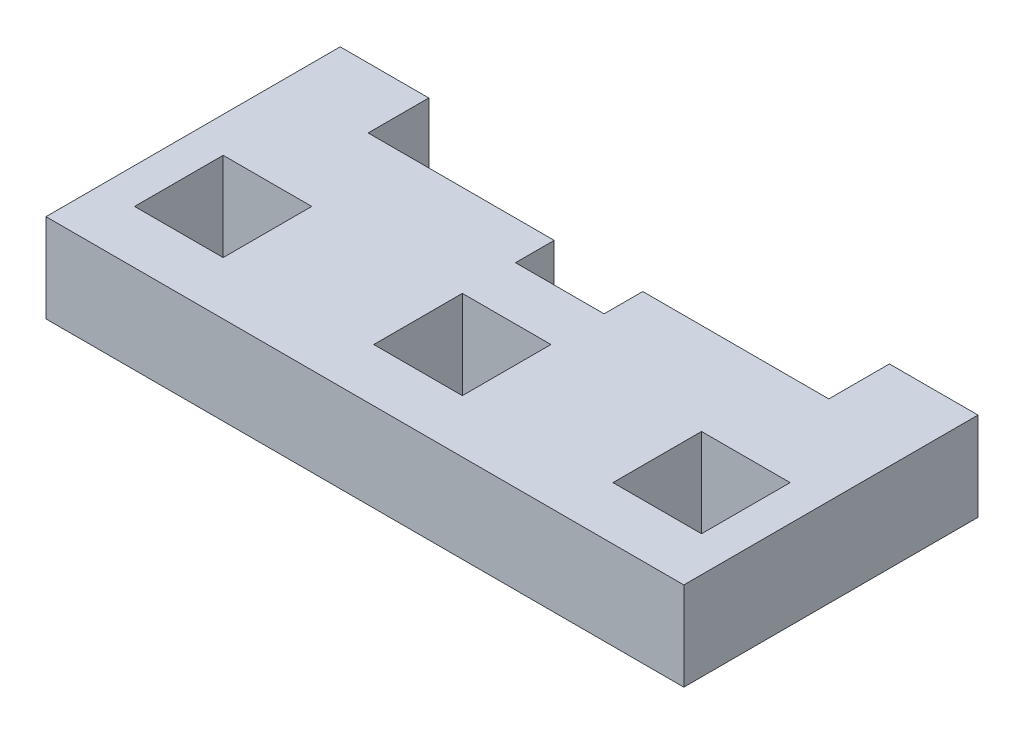
ISO-10303-21;
HEADER;
FILE_DESCRIPTION(('STEP AP214'),'2;1');
FILE_NAME('part.step','',(''),(''),'','','');
FILE_SCHEMA(('AUTOMOTIVE_DESIGN { 1 0 10303 214 1 1 1 1 }'));
ENDSEC;
DATA;
#1=APPLICATION_CONTEXT('core data for automotive mechanical design processes');
#2=APPLICATION_PROTOCOL_DEFINITION('international standard','automotive_design',2000,#1);
#3=PRODUCT_CONTEXT('',#1,'mechanical');
#4=PRODUCT('Part','Part','',(#3));
#5=PRODUCT_RELATED_PRODUCT_CATEGORY('part','',(#4));
#6=PRODUCT_DEFINITION_FORMATION('','',#4);
#7=PRODUCT_DEFINITION_CONTEXT('part definition',#1,'design');
#8=PRODUCT_DEFINITION('design','',#6,#7);
#9=PRODUCT_DEFINITION_SHAPE('','',#8);
#10=(LENGTH_UNIT() NAMED_UNIT(*) SI_UNIT(.MILLI.,.METRE.));
#11=(NAMED_UNIT(*) PLANE_ANGLE_UNIT() SI_UNIT($,.RADIAN.));
#12=(NAMED_UNIT(*) SI_UNIT($,.STERADIAN.) SOLID_ANGLE_UNIT());
#13=UNCERTAINTY_MEASURE_WITH_UNIT(LENGTH_MEASURE(1.E-05),#10,'distance_accuracy_value','');
#14=(GEOMETRIC_REPRESENTATION_CONTEXT(3) GLOBAL_UNCERTAINTY_ASSIGNED_CONTEXT((#13)) GLOBAL_UNIT_ASSIGNED_CONTEXT((#10,
#11,#12)) REPRESENTATION_CONTEXT('',''));
#15=CARTESIAN_POINT('',(0.,0.,0.));
#16=DIRECTION('',(0.,0.,1.));
#17=DIRECTION('',(1.,0.,0.));
#18=AXIS2_PLACEMENT_3D('',#15,#16,#17);
#19=CARTESIAN_POINT('',(0.,6.35,0.));
#20=DIRECTION('',(0.,-1.,0.));
#21=DIRECTION('',(0.,0.,-1.));
#22=AXIS2_PLACEMENT_3D('',#19,#20,#21);
#23=PLANE('',#22);
#24=DIRECTION('',(0.,0.,-1.));
#25=VECTOR('',#24,1.);
#26=CARTESIAN_POINT('',(20.32,6.35,3.175));
#27=LINE('',#26,#25);
#28=CARTESIAN_POINT('',(20.32,6.35,3.175));
#29=VERTEX_POINT('',#28);
#30=CARTESIAN_POINT('',(20.32,6.35,-3.175));
#31=VERTEX_POINT('',#30);
#32=EDGE_CURVE('E230',#29,#31,#27,.T.);
#33=ORIENTED_EDGE('',*,*,#32,.F.);
#34=DIRECTION('',(1.,0.,0.));
#35=VECTOR('',#34,1.);
#36=CARTESIAN_POINT('',(20.32,6.35,3.175));
#37=LINE('',#36,#35);
#38=CARTESIAN_POINT('',(13.97,6.35,3.175));
#39=VERTEX_POINT('',#38);
#40=EDGE_CURVE('E238',#39,#29,#37,.T.);
#41=ORIENTED_EDGE('',*,*,#40,.F.);
#42=DIRECTION('',(0.,0.,1.));
#43=VECTOR('',#42,1.);
#44=CARTESIAN_POINT('',(13.97,6.35,3.175));
#45=LINE('',#44,#43);
#46=CARTESIAN_POINT('',(13.97,6.35,-3.175));
#47=VERTEX_POINT('',#46);
#48=EDGE_CURVE('E235',#47,#39,#45,.T.);
#49=ORIENTED_EDGE('',*,*,#48,.F.);
#50=DIRECTION('',(-1.,0.,0.));
#51=VECTOR('',#50,1.);
#52=CARTESIAN_POINT('',(20.32,6.35,-3.175));
#53=LINE('',#52,#51);
#54=EDGE_CURVE('E232',#31,#47,#53,.T.);
#55=ORIENTED_EDGE('',*,*,#54,.F.);
#56=EDGE_LOOP('',(#33,#41,#49,#55));
#57=FACE_BOUND('',#56,.T.);
#58=DIRECTION('',(0.,0.,1.));
#59=VECTOR('',#58,1.);
#60=CARTESIAN_POINT('',(-22.86,6.35,6.985));
#61=LINE('',#60,#59);
#62=CARTESIAN_POINT('',(-22.86,6.35,-14.102499989));
#63=VERTEX_POINT('',#62);
#64=CARTESIAN_POINT('',(-22.86,6.35,6.985));
#65=VERTEX_POINT('',#64);
#66=EDGE_CURVE('E292',#63,#65,#61,.T.);
#67=ORIENTED_EDGE('',*,*,#66,.T.);
#68=DIRECTION('',(1.,0.,0.));
#69=VECTOR('',#68,1.);
#70=CARTESIAN_POINT('',(-22.86,6.35,6.985));
#71=LINE('',#70,#69);
#72=CARTESIAN_POINT('',(22.86,6.35,6.985));
#73=VERTEX_POINT('',#72);
#74=EDGE_CURVE('E295',#65,#73,#71,.T.);
#75=ORIENTED_EDGE('',*,*,#74,.T.);
#76=DIRECTION('',(0.,0.,-1.));
#77=VECTOR('',#76,1.);
#78=CARTESIAN_POINT('',(22.86,6.35,6.985));
#79=LINE('',#78,#77);
#80=CARTESIAN_POINT('',(22.86,6.35,-14.102499989));
#81=VERTEX_POINT('',#80);
#82=EDGE_CURVE('E298',#73,#81,#79,.T.);
#83=ORIENTED_EDGE('',*,*,#82,.T.);
#84=DIRECTION('',(-1.,0.,0.));
#85=VECTOR('',#84,1.);
#86=CARTESIAN_POINT('',(22.86,6.35,-14.102499989));
#87=LINE('',#86,#85);
#88=CARTESIAN_POINT('',(16.51,6.35,-14.102499989));
#89=VERTEX_POINT('',#88);
#90=EDGE_CURVE('E300',#81,#89,#87,.T.);
#91=ORIENTED_EDGE('',*,*,#90,.T.);
#92=DIRECTION('',(0.,0.,1.));
#93=VECTOR('',#92,1.);
#94=CARTESIAN_POINT('',(16.51,6.35,-14.102499989));
#95=LINE('',#94,#93);
#96=CARTESIAN_POINT('',(16.51,6.35,-9.75750004299999));
#97=VERTEX_POINT('',#96);
#98=EDGE_CURVE('E302',#89,#97,#95,.T.);
#99=ORIENTED_EDGE('',*,*,#98,.T.);
#100=DIRECTION('',(-1.,0.,0.));
#101=VECTOR('',#100,1.);
#102=CARTESIAN_POINT('',(3.175,6.35,-9.75750004299999));
#103=LINE('',#102,#101);
#104=CARTESIAN_POINT('',(3.175,6.35,-9.75750004299999));
#105=VERTEX_POINT('',#104);
#106=EDGE_CURVE('E304',#97,#105,#103,.T.);
#107=ORIENTED_EDGE('',*,*,#106,.T.);
#108=DIRECTION('',(0.,0.,1.));
#109=VECTOR('',#108,1.);
#110=CARTESIAN_POINT('',(3.175,6.35,-6.985));
#111=LINE('',#110,#109);
#112=CARTESIAN_POINT('',(3.175,6.35,-6.985));
#113=VERTEX_POINT('',#112);
#114=EDGE_CURVE('E306',#105,#113,#111,.T.);
#115=ORIENTED_EDGE('',*,*,#114,.T.);
#116=DIRECTION('',(-1.,0.,0.));
#117=VECTOR('',#116,1.);
#118=CARTESIAN_POINT('',(-3.175,6.35,-6.98500000000001));
#119=LINE('',#118,#117);
#120=CARTESIAN_POINT('',(-3.175,6.35,-6.98500000000001));
#121=VERTEX_POINT('',#120);
#122=EDGE_CURVE('E308',#113,#121,#119,.T.);
#123=ORIENTED_EDGE('',*,*,#122,.T.);
#124=DIRECTION('',(0.,0.,-1.));
#125=VECTOR('',#124,1.);
#126=CARTESIAN_POINT('',(-3.175,6.35,-9.75750004299999));
#127=LINE('',#126,#125);
#128=CARTESIAN_POINT('',(-3.175,6.35,-9.75750004299999));
#129=VERTEX_POINT('',#128);
#130=EDGE_CURVE('E310',#121,#129,#127,.T.);
#131=ORIENTED_EDGE('',*,*,#130,.T.);
#132=DIRECTION('',(-1.,0.,0.));
#133=VECTOR('',#132,1.);
#134=CARTESIAN_POINT('',(-16.51,6.35,-9.75750004299999));
#135=LINE('',#134,#133);
#136=CARTESIAN_POINT('',(-16.51,6.35,-9.75750004299999));
#137=VERTEX_POINT('',#136);
#138=EDGE_CURVE('E312',#129,#137,#135,.T.);
#139=ORIENTED_EDGE('',*,*,#138,.T.);
#140=DIRECTION('',(0.,0.,-1.));
#141=VECTOR('',#140,1.);
#142=CARTESIAN_POINT('',(-16.51,6.35,-14.102499989));
#143=LINE('',#142,#141);
#144=CARTESIAN_POINT('',(-16.51,6.35,-14.102499989));
#145=VERTEX_POINT('',#144);
#146=EDGE_CURVE('E314',#137,#145,#143,.T.);
#147=ORIENTED_EDGE('',*,*,#146,.T.);
#148=DIRECTION('',(-1.,0.,0.));
#149=VECTOR('',#148,1.);
#150=CARTESIAN_POINT('',(-22.86,6.35,-14.102499989));
#151=LINE('',#150,#149);
#152=EDGE_CURVE('E316',#145,#63,#151,.T.);
#153=ORIENTED_EDGE('',*,*,#152,.T.);
#154=EDGE_LOOP('',(#67,#75,#83,#91,#99,#107,#115,#123,#131,#139,#147,#153));
#155=FACE_BOUND('',#154,.T.);
#156=DIRECTION('',(0.,0.,-1.));
#157=VECTOR('',#156,1.);
#158=CARTESIAN_POINT('',(3.175,6.35,-3.17500000000001));
#159=LINE('',#158,#157);
#160=CARTESIAN_POINT('',(3.175,6.35,3.17500000000001));
#161=VERTEX_POINT('',#160);
#162=CARTESIAN_POINT('',(3.175,6.35,-3.17500000000001));
#163=VERTEX_POINT('',#162);
#164=EDGE_CURVE('E261',#161,#163,#159,.T.);
#165=ORIENTED_EDGE('',*,*,#164,.F.);
#166=DIRECTION('',(1.,0.,0.));
#167=VECTOR('',#166,1.);
#168=CARTESIAN_POINT('',(-3.17500000000002,6.35,3.17500000000002));
#169=LINE('',#168,#167);
#170=CARTESIAN_POINT('',(-3.17500000000002,6.35,3.17500000000002));
#171=VERTEX_POINT('',#170);
#172=EDGE_CURVE('E269',#171,#161,#169,.T.);
#173=ORIENTED_EDGE('',*,*,#172,.F.);
#174=DIRECTION('',(0.,0.,1.));
#175=VECTOR('',#174,1.);
#176=CARTESIAN_POINT('',(-3.17500000000002,6.35,-3.17500000000001));
#177=LINE('',#176,#175);
#178=CARTESIAN_POINT('',(-3.17500000000002,6.35,-3.17500000000001));
#179=VERTEX_POINT('',#178);
#180=EDGE_CURVE('E266',#179,#171,#177,.T.);
#181=ORIENTED_EDGE('',*,*,#180,.F.);
#182=DIRECTION('',(-1.,0.,0.));
#183=VECTOR('',#182,1.);
#184=CARTESIAN_POINT('',(-3.17500000000002,6.35,-3.17500000000001));
#185=LINE('',#184,#183);
#186=EDGE_CURVE('E263',#163,#179,#185,.T.);
#187=ORIENTED_EDGE('',*,*,#186,.F.);
#188=EDGE_LOOP('',(#165,#173,#181,#187));
#189=FACE_BOUND('',#188,.T.);
#190=DIRECTION('',(1.,0.,0.));
#191=VECTOR('',#190,1.);
#192=CARTESIAN_POINT('',(-20.32,6.35,3.175));
#193=LINE('',#192,#191);
#194=CARTESIAN_POINT('',(-20.32,6.35,3.175));
#195=VERTEX_POINT('',#194);
#196=CARTESIAN_POINT('',(-13.97,6.35,3.175));
#197=VERTEX_POINT('',#196);
#198=EDGE_CURVE('E194',#195,#197,#193,.T.);
#199=ORIENTED_EDGE('',*,*,#198,.F.);
#200=DIRECTION('',(0.,0.,1.));
#201=VECTOR('',#200,1.);
#202=CARTESIAN_POINT('',(-20.32,6.35,3.175));
#203=LINE('',#202,#201);
#204=CARTESIAN_POINT('',(-20.32,6.35,-3.175));
#205=VERTEX_POINT('',#204);
#206=EDGE_CURVE('E216',#205,#195,#203,.T.);
#207=ORIENTED_EDGE('',*,*,#206,.F.);
#208=DIRECTION('',(-1.,0.,0.));
#209=VECTOR('',#208,1.);
#210=CARTESIAN_POINT('',(-20.32,6.35,-3.175));
#211=LINE('',#210,#209);
#212=CARTESIAN_POINT('',(-13.97,6.35,-3.175));
#213=VERTEX_POINT('',#212);
#214=EDGE_CURVE('E214',#213,#205,#211,.T.);
#215=ORIENTED_EDGE('',*,*,#214,.F.);
#216=DIRECTION('',(0.,0.,-1.));
#217=VECTOR('',#216,1.);
#218=CARTESIAN_POINT('',(-13.97,6.35,3.175));
#219=LINE('',#218,#217);
#220=EDGE_CURVE('E202',#197,#213,#219,.T.);
#221=ORIENTED_EDGE('',*,*,#220,.F.);
#222=EDGE_LOOP('',(#199,#207,#215,#221));
#223=FACE_BOUND('',#222,.T.);
#224=ADVANCED_FACE('F33',(#57,#155,#189,#223),#23,.F.);
#225=CARTESIAN_POINT('',(0.,0.,0.));
#226=DIRECTION('',(0.,-1.,0.));
#227=DIRECTION('',(0.,0.,-1.));
#228=AXIS2_PLACEMENT_3D('',#225,#226,#227);
#229=PLANE('',#228);
#230=DIRECTION('',(1.,0.,0.));
#231=VECTOR('',#230,1.);
#232=CARTESIAN_POINT('',(20.32,0.,3.175));
#233=LINE('',#232,#231);
#234=CARTESIAN_POINT('',(13.97,0.,3.175));
#235=VERTEX_POINT('',#234);
#236=CARTESIAN_POINT('',(20.32,0.,3.175));
#237=VERTEX_POINT('',#236);
#238=EDGE_CURVE('E233',#235,#237,#233,.T.);
#239=ORIENTED_EDGE('',*,*,#238,.T.);
#240=DIRECTION('',(0.,0.,-1.));
#241=VECTOR('',#240,1.);
#242=CARTESIAN_POINT('',(20.32,0.,3.175));
#243=LINE('',#242,#241);
#244=CARTESIAN_POINT('',(20.32,0.,-3.175));
#245=VERTEX_POINT('',#244);
#246=EDGE_CURVE('E210',#237,#245,#243,.T.);
#247=ORIENTED_EDGE('',*,*,#246,.T.);
#248=DIRECTION('',(-1.,0.,0.));
#249=VECTOR('',#248,1.);
#250=CARTESIAN_POINT('',(20.32,0.,-3.175));
#251=LINE('',#250,#249);
#252=CARTESIAN_POINT('',(13.97,0.,-3.175));
#253=VERTEX_POINT('',#252);
#254=EDGE_CURVE('E243',#245,#253,#251,.T.);
#255=ORIENTED_EDGE('',*,*,#254,.T.);
#256=DIRECTION('',(0.,0.,1.));
#257=VECTOR('',#256,1.);
#258=CARTESIAN_POINT('',(13.97,0.,3.175));
#259=LINE('',#258,#257);
#260=EDGE_CURVE('E246',#253,#235,#259,.T.);
#261=ORIENTED_EDGE('',*,*,#260,.T.);
#262=EDGE_LOOP('',(#239,#247,#255,#261));
#263=FACE_BOUND('',#262,.T.);
#264=DIRECTION('',(1.,0.,0.));
#265=VECTOR('',#264,1.);
#266=CARTESIAN_POINT('',(-22.86,0.,6.985));
#267=LINE('',#266,#265);
#268=CARTESIAN_POINT('',(-22.86,0.,6.985));
#269=VERTEX_POINT('',#268);
#270=CARTESIAN_POINT('',(22.86,0.,6.985));
#271=VERTEX_POINT('',#270);
#272=EDGE_CURVE('E291',#269,#271,#267,.T.);
#273=ORIENTED_EDGE('',*,*,#272,.F.);
#274=DIRECTION('',(0.,0.,1.));
#275=VECTOR('',#274,1.);
#276=CARTESIAN_POINT('',(-22.86,0.,-9.75750004299999));
#277=LINE('',#276,#275);
#278=CARTESIAN_POINT('',(-22.86,0.,-14.102499989));
#279=VERTEX_POINT('',#278);
#280=EDGE_CURVE('E296',#279,#269,#277,.T.);
#281=ORIENTED_EDGE('',*,*,#280,.F.);
#282=DIRECTION('',(-1.,0.,0.));
#283=VECTOR('',#282,1.);
#284=CARTESIAN_POINT('',(-22.86,0.,-14.102499989));
#285=LINE('',#284,#283);
#286=CARTESIAN_POINT('',(-16.51,0.,-14.102499989));
#287=VERTEX_POINT('',#286);
#288=EDGE_CURVE('E340',#287,#279,#285,.T.);
#289=ORIENTED_EDGE('',*,*,#288,.F.);
#290=DIRECTION('',(0.,0.,-1.));
#291=VECTOR('',#290,1.);
#292=CARTESIAN_POINT('',(-16.51,0.,-14.102499989));
#293=LINE('',#292,#291);
#294=CARTESIAN_POINT('',(-16.51,0.,-9.75750004299999));
#295=VERTEX_POINT('',#294);
#296=EDGE_CURVE('E338',#295,#287,#293,.T.);
#297=ORIENTED_EDGE('',*,*,#296,.F.);
#298=DIRECTION('',(-1.,0.,0.));
#299=VECTOR('',#298,1.);
#300=CARTESIAN_POINT('',(-16.51,0.,-9.75750004299999));
#301=LINE('',#300,#299);
#302=CARTESIAN_POINT('',(-3.175,0.,-9.75750004299999));
#303=VERTEX_POINT('',#302);
#304=EDGE_CURVE('E336',#303,#295,#301,.T.);
#305=ORIENTED_EDGE('',*,*,#304,.F.);
#306=DIRECTION('',(0.,0.,-1.));
#307=VECTOR('',#306,1.);
#308=CARTESIAN_POINT('',(-3.175,0.,-9.75750004299999));
#309=LINE('',#308,#307);
#310=CARTESIAN_POINT('',(-3.175,0.,-6.98500000000001));
#311=VERTEX_POINT('',#310);
#312=EDGE_CURVE('E334',#311,#303,#309,.T.);
#313=ORIENTED_EDGE('',*,*,#312,.F.);
#314=DIRECTION('',(-1.,0.,0.));
#315=VECTOR('',#314,1.);
#316=CARTESIAN_POINT('',(-3.175,0.,-6.98500000000001));
#317=LINE('',#316,#315);
#318=CARTESIAN_POINT('',(3.175,0.,-6.985));
#319=VERTEX_POINT('',#318);
#320=EDGE_CURVE('E332',#319,#311,#317,.T.);
#321=ORIENTED_EDGE('',*,*,#320,.F.);
#322=DIRECTION('',(0.,0.,1.));
#323=VECTOR('',#322,1.);
#324=CARTESIAN_POINT('',(3.175,0.,-6.985));
#325=LINE('',#324,#323);
#326=CARTESIAN_POINT('',(3.175,0.,-9.75750004299999));
#327=VERTEX_POINT('',#326);
#328=EDGE_CURVE('E330',#327,#319,#325,.T.);
#329=ORIENTED_EDGE('',*,*,#328,.F.);
#330=DIRECTION('',(-1.,0.,0.));
#331=VECTOR('',#330,1.);
#332=CARTESIAN_POINT('',(3.175,0.,-9.75750004299999));
#333=LINE('',#332,#331);
#334=CARTESIAN_POINT('',(16.51,0.,-9.75750004299999));
#335=VERTEX_POINT('',#334);
#336=EDGE_CURVE('E328',#335,#327,#333,.T.);
#337=ORIENTED_EDGE('',*,*,#336,.F.);
#338=DIRECTION('',(0.,0.,1.));
#339=VECTOR('',#338,1.);
#340=CARTESIAN_POINT('',(16.51,0.,-14.102499989));
#341=LINE('',#340,#339);
#342=CARTESIAN_POINT('',(16.51,0.,-14.102499989));
#343=VERTEX_POINT('',#342);
#344=EDGE_CURVE('E326',#343,#335,#341,.T.);
#345=ORIENTED_EDGE('',*,*,#344,.F.);
#346=DIRECTION('',(-1.,0.,0.));
#347=VECTOR('',#346,1.);
#348=CARTESIAN_POINT('',(22.86,0.,-14.102499989));
#349=LINE('',#348,#347);
#350=CARTESIAN_POINT('',(22.86,0.,-14.102499989));
#351=VERTEX_POINT('',#350);
#352=EDGE_CURVE('E324',#351,#343,#349,.T.);
#353=ORIENTED_EDGE('',*,*,#352,.F.);
#354=DIRECTION('',(0.,0.,-1.));
#355=VECTOR('',#354,1.);
#356=CARTESIAN_POINT('',(22.86,0.,-9.75750004299999));
#357=LINE('',#356,#355);
#358=EDGE_CURVE('E322',#271,#351,#357,.T.);
#359=ORIENTED_EDGE('',*,*,#358,.F.);
#360=EDGE_LOOP('',(#273,#281,#289,#297,#305,#313,#321,#329,#337,#345,#353,#359));
#361=FACE_BOUND('',#360,.T.);
#362=DIRECTION('',(1.,0.,0.));
#363=VECTOR('',#362,1.);
#364=CARTESIAN_POINT('',(-3.17500000000002,0.,3.17500000000002));
#365=LINE('',#364,#363);
#366=CARTESIAN_POINT('',(-3.17500000000002,0.,3.17500000000002));
#367=VERTEX_POINT('',#366);
#368=CARTESIAN_POINT('',(3.175,0.,3.17500000000001));
#369=VERTEX_POINT('',#368);
#370=EDGE_CURVE('E264',#367,#369,#365,.T.);
#371=ORIENTED_EDGE('',*,*,#370,.T.);
#372=DIRECTION('',(0.,0.,-1.));
#373=VECTOR('',#372,1.);
#374=CARTESIAN_POINT('',(3.175,0.,-3.17500000000001));
#375=LINE('',#374,#373);
#376=CARTESIAN_POINT('',(3.175,0.,-3.17500000000001));
#377=VERTEX_POINT('',#376);
#378=EDGE_CURVE('E260',#369,#377,#375,.T.);
#379=ORIENTED_EDGE('',*,*,#378,.T.);
#380=DIRECTION('',(-1.,0.,0.));
#381=VECTOR('',#380,1.);
#382=CARTESIAN_POINT('',(-3.17500000000002,0.,-3.17500000000001));
#383=LINE('',#382,#381);
#384=CARTESIAN_POINT('',(-3.17500000000002,0.,-3.17500000000001));
#385=VERTEX_POINT('',#384);
#386=EDGE_CURVE('E274',#377,#385,#383,.T.);
#387=ORIENTED_EDGE('',*,*,#386,.T.);
#388=DIRECTION('',(0.,0.,1.));
#389=VECTOR('',#388,1.);
#390=CARTESIAN_POINT('',(-3.17500000000002,0.,-3.17500000000001));
#391=LINE('',#390,#389);
#392=EDGE_CURVE('E277',#385,#367,#391,.T.);
#393=ORIENTED_EDGE('',*,*,#392,.T.);
#394=EDGE_LOOP('',(#371,#379,#387,#393));
#395=FACE_BOUND('',#394,.T.);
#396=DIRECTION('',(0.,0.,1.));
#397=VECTOR('',#396,1.);
#398=CARTESIAN_POINT('',(-20.32,0.,3.175));
#399=LINE('',#398,#397);
#400=CARTESIAN_POINT('',(-20.32,0.,-3.175));
#401=VERTEX_POINT('',#400);
#402=CARTESIAN_POINT('',(-20.32,0.,3.175));
#403=VERTEX_POINT('',#402);
#404=EDGE_CURVE('E203',#401,#403,#399,.T.);
#405=ORIENTED_EDGE('',*,*,#404,.T.);
#406=DIRECTION('',(1.,0.,0.));
#407=VECTOR('',#406,1.);
#408=CARTESIAN_POINT('',(-20.32,0.,3.175));
#409=LINE('',#408,#407);
#410=CARTESIAN_POINT('',(-13.97,0.,3.175));
#411=VERTEX_POINT('',#410);
#412=EDGE_CURVE('E56',#403,#411,#409,.T.);
#413=ORIENTED_EDGE('',*,*,#412,.T.);
#414=DIRECTION('',(0.,0.,-1.));
#415=VECTOR('',#414,1.);
#416=CARTESIAN_POINT('',(-13.97,0.,3.175));
#417=LINE('',#416,#415);
#418=CARTESIAN_POINT('',(-13.97,0.,-3.175));
#419=VERTEX_POINT('',#418);
#420=EDGE_CURVE('E209',#411,#419,#417,.T.);
#421=ORIENTED_EDGE('',*,*,#420,.T.);
#422=DIRECTION('',(-1.,0.,0.));
#423=VECTOR('',#422,1.);
#424=CARTESIAN_POINT('',(-20.32,0.,-3.175));
#425=LINE('',#424,#423);
#426=EDGE_CURVE('E222',#419,#401,#425,.T.);
#427=ORIENTED_EDGE('',*,*,#426,.T.);
#428=EDGE_LOOP('',(#405,#413,#421,#427));
#429=FACE_BOUND('',#428,.T.);
#430=ADVANCED_FACE('F382',(#263,#361,#395,#429),#229,.T.);
#431=CARTESIAN_POINT('',(-22.86,6.35,6.985));
#432=DIRECTION('',(0.,0.,-1.));
#433=DIRECTION('',(-1.,0.,0.));
#434=AXIS2_PLACEMENT_3D('',#431,#432,#433);
#435=PLANE('',#434);
#436=ORIENTED_EDGE('',*,*,#272,.T.);
#437=DIRECTION('',(0.,-1.,0.));
#438=VECTOR('',#437,1.);
#439=CARTESIAN_POINT('',(22.86,6.35,6.985));
#440=LINE('',#439,#438);
#441=EDGE_CURVE('E41',#73,#271,#440,.T.);
#442=ORIENTED_EDGE('',*,*,#441,.F.);
#443=ORIENTED_EDGE('',*,*,#74,.F.);
#444=DIRECTION('',(0.,-1.,0.));
#445=VECTOR('',#444,1.);
#446=CARTESIAN_POINT('',(-22.86,6.35,6.985));
#447=LINE('',#446,#445);
#448=EDGE_CURVE('E11',#65,#269,#447,.T.);
#449=ORIENTED_EDGE('',*,*,#448,.T.);
#450=EDGE_LOOP('',(#436,#442,#443,#449));
#451=FACE_BOUND('',#450,.T.);
#452=ADVANCED_FACE('F35',(#451),#435,.F.);
#453=CARTESIAN_POINT('',(22.86,6.35,-9.75750004299999));
#454=DIRECTION('',(-1.,0.,0.));
#455=DIRECTION('',(0.,0.,1.));
#456=AXIS2_PLACEMENT_3D('',#453,#454,#455);
#457=PLANE('',#456);
#458=ORIENTED_EDGE('',*,*,#358,.T.);
#459=DIRECTION('',(0.,-1.,0.));
#460=VECTOR('',#459,1.);
#461=CARTESIAN_POINT('',(22.86,6.35,-14.102499989));
#462=LINE('',#461,#460);
#463=EDGE_CURVE('E369',#81,#351,#462,.T.);
#464=ORIENTED_EDGE('',*,*,#463,.F.);
#465=ORIENTED_EDGE('',*,*,#82,.F.);
#466=ORIENTED_EDGE('',*,*,#441,.T.);
#467=EDGE_LOOP('',(#458,#464,#465,#466));
#468=FACE_BOUND('',#467,.T.);
#469=ADVANCED_FACE('F375',(#468),#457,.F.);
#470=CARTESIAN_POINT('',(22.86,6.35,-14.102499989));
#471=DIRECTION('',(0.,0.,1.));
#472=DIRECTION('',(1.,0.,0.));
#473=AXIS2_PLACEMENT_3D('',#470,#471,#472);
#474=PLANE('',#473);
#475=ORIENTED_EDGE('',*,*,#352,.T.);
#476=DIRECTION('',(0.,-1.,0.));
#477=VECTOR('',#476,1.);
#478=CARTESIAN_POINT('',(16.51,6.35,-14.102499989));
#479=LINE('',#478,#477);
#480=EDGE_CURVE('E366',#89,#343,#479,.T.);
#481=ORIENTED_EDGE('',*,*,#480,.F.);
#482=ORIENTED_EDGE('',*,*,#90,.F.);
#483=ORIENTED_EDGE('',*,*,#463,.T.);
#484=EDGE_LOOP('',(#475,#481,#482,#483));
#485=FACE_BOUND('',#484,.T.);
#486=ADVANCED_FACE('F390',(#485),#474,.F.);
#487=CARTESIAN_POINT('',(16.51,6.35,-14.102499989));
#488=DIRECTION('',(1.,0.,0.));
#489=DIRECTION('',(0.,0.,-1.));
#490=AXIS2_PLACEMENT_3D('',#487,#488,#489);
#491=PLANE('',#490);
#492=ORIENTED_EDGE('',*,*,#344,.T.);
#493=DIRECTION('',(0.,-1.,0.));
#494=VECTOR('',#493,1.);
#495=CARTESIAN_POINT('',(16.51,6.35,-9.75750004299999));
#496=LINE('',#495,#494);
#497=EDGE_CURVE('E363',#97,#335,#496,.T.);
#498=ORIENTED_EDGE('',*,*,#497,.F.);
#499=ORIENTED_EDGE('',*,*,#98,.F.);
#500=ORIENTED_EDGE('',*,*,#480,.T.);
#501=EDGE_LOOP('',(#492,#498,#499,#500));
#502=FACE_BOUND('',#501,.T.);
#503=ADVANCED_FACE('F394',(#502),#491,.F.);
#504=CARTESIAN_POINT('',(3.175,6.35,-9.75750004299999));
#505=DIRECTION('',(0.,0.,1.));
#506=DIRECTION('',(1.,0.,0.));
#507=AXIS2_PLACEMENT_3D('',#504,#505,#506);
#508=PLANE('',#507);
#509=ORIENTED_EDGE('',*,*,#336,.T.);
#510=DIRECTION('',(0.,-1.,0.));
#511=VECTOR('',#510,1.);
#512=CARTESIAN_POINT('',(3.175,6.35,-9.75750004299999));
#513=LINE('',#512,#511);
#514=EDGE_CURVE('E360',#105,#327,#513,.T.);
#515=ORIENTED_EDGE('',*,*,#514,.F.);
#516=ORIENTED_EDGE('',*,*,#106,.F.);
#517=ORIENTED_EDGE('',*,*,#497,.T.);
#518=EDGE_LOOP('',(#509,#515,#516,#517));
#519=FACE_BOUND('',#518,.T.);
#520=ADVANCED_FACE('F432',(#519),#508,.F.);
#521=CARTESIAN_POINT('',(3.175,6.35,-6.985));
#522=DIRECTION('',(1.,0.,0.));
#523=DIRECTION('',(0.,0.,-1.));
#524=AXIS2_PLACEMENT_3D('',#521,#522,#523);
#525=PLANE('',#524);
#526=ORIENTED_EDGE('',*,*,#328,.T.);
#527=DIRECTION('',(0.,-1.,0.));
#528=VECTOR('',#527,1.);
#529=CARTESIAN_POINT('',(3.175,6.35,-6.985));
#530=LINE('',#529,#528);
#531=EDGE_CURVE('E357',#113,#319,#530,.T.);
#532=ORIENTED_EDGE('',*,*,#531,.F.);
#533=ORIENTED_EDGE('',*,*,#114,.F.);
#534=ORIENTED_EDGE('',*,*,#514,.T.);
#535=EDGE_LOOP('',(#526,#532,#533,#534));
#536=FACE_BOUND('',#535,.T.);
#537=ADVANCED_FACE('F430',(#536),#525,.F.);
#538=CARTESIAN_POINT('',(-3.175,6.35,-6.98500000000001));
#539=DIRECTION('',(0.,0.,1.));
#540=DIRECTION('',(1.,0.,0.));
#541=AXIS2_PLACEMENT_3D('',#538,#539,#540);
#542=PLANE('',#541);
#543=ORIENTED_EDGE('',*,*,#320,.T.);
#544=DIRECTION('',(0.,-1.,0.));
#545=VECTOR('',#544,1.);
#546=CARTESIAN_POINT('',(-3.175,6.35,-6.98500000000001));
#547=LINE('',#546,#545);
#548=EDGE_CURVE('E354',#121,#311,#547,.T.);
#549=ORIENTED_EDGE('',*,*,#548,.F.);
#550=ORIENTED_EDGE('',*,*,#122,.F.);
#551=ORIENTED_EDGE('',*,*,#531,.T.);
#552=EDGE_LOOP('',(#543,#549,#550,#551));
#553=FACE_BOUND('',#552,.T.);
#554=ADVANCED_FACE('F425',(#553),#542,.F.);
#555=CARTESIAN_POINT('',(-3.175,6.35,-9.75750004299999));
#556=DIRECTION('',(-1.,0.,0.));
#557=DIRECTION('',(0.,0.,1.));
#558=AXIS2_PLACEMENT_3D('',#555,#556,#557);
#559=PLANE('',#558);
#560=ORIENTED_EDGE('',*,*,#312,.T.);
#561=DIRECTION('',(0.,-1.,0.));
#562=VECTOR('',#561,1.);
#563=CARTESIAN_POINT('',(-3.175,6.35,-9.75750004299999));
#564=LINE('',#563,#562);
#565=EDGE_CURVE('E351',#129,#303,#564,.T.);
#566=ORIENTED_EDGE('',*,*,#565,.F.);
#567=ORIENTED_EDGE('',*,*,#130,.F.);
#568=ORIENTED_EDGE('',*,*,#548,.T.);
#569=EDGE_LOOP('',(#560,#566,#567,#568));
#570=FACE_BOUND('',#569,.T.);
#571=ADVANCED_FACE('F420',(#570),#559,.F.);
#572=CARTESIAN_POINT('',(-16.51,6.35,-9.75750004299999));
#573=DIRECTION('',(0.,0.,1.));
#574=DIRECTION('',(1.,0.,0.));
#575=AXIS2_PLACEMENT_3D('',#572,#573,#574);
#576=PLANE('',#575);
#577=ORIENTED_EDGE('',*,*,#304,.T.);
#578=DIRECTION('',(0.,-1.,0.));
#579=VECTOR('',#578,1.);
#580=CARTESIAN_POINT('',(-16.51,6.35,-9.75750004299999));
#581=LINE('',#580,#579);
#582=EDGE_CURVE('E348',#137,#295,#581,.T.);
#583=ORIENTED_EDGE('',*,*,#582,.F.);
#584=ORIENTED_EDGE('',*,*,#138,.F.);
#585=ORIENTED_EDGE('',*,*,#565,.T.);
#586=EDGE_LOOP('',(#577,#583,#584,#585));
#587=FACE_BOUND('',#586,.T.);
#588=ADVANCED_FACE('F416',(#587),#576,.F.);
#589=CARTESIAN_POINT('',(-16.51,6.35,-14.102499989));
#590=DIRECTION('',(-1.,0.,0.));
#591=DIRECTION('',(0.,0.,1.));
#592=AXIS2_PLACEMENT_3D('',#589,#590,#591);
#593=PLANE('',#592);
#594=ORIENTED_EDGE('',*,*,#296,.T.);
#595=DIRECTION('',(0.,-1.,0.));
#596=VECTOR('',#595,1.);
#597=CARTESIAN_POINT('',(-16.51,6.35,-14.102499989));
#598=LINE('',#597,#596);
#599=EDGE_CURVE('E345',#145,#287,#598,.T.);
#600=ORIENTED_EDGE('',*,*,#599,.F.);
#601=ORIENTED_EDGE('',*,*,#146,.F.);
#602=ORIENTED_EDGE('',*,*,#582,.T.);
#603=EDGE_LOOP('',(#594,#600,#601,#602));
#604=FACE_BOUND('',#603,.T.);
#605=ADVANCED_FACE('F411',(#604),#593,.F.);
#606=CARTESIAN_POINT('',(-22.86,6.35,-14.102499989));
#607=DIRECTION('',(0.,0.,1.));
#608=DIRECTION('',(1.,0.,0.));
#609=AXIS2_PLACEMENT_3D('',#606,#607,#608);
#610=PLANE('',#609);
#611=ORIENTED_EDGE('',*,*,#288,.T.);
#612=DIRECTION('',(0.,-1.,0.));
#613=VECTOR('',#612,1.);
#614=CARTESIAN_POINT('',(-22.86,6.35,-14.102499989));
#615=LINE('',#614,#613);
#616=EDGE_CURVE('E319',#63,#279,#615,.T.);
#617=ORIENTED_EDGE('',*,*,#616,.F.);
#618=ORIENTED_EDGE('',*,*,#152,.F.);
#619=ORIENTED_EDGE('',*,*,#599,.T.);
#620=EDGE_LOOP('',(#611,#617,#618,#619));
#621=FACE_BOUND('',#620,.T.);
#622=ADVANCED_FACE('F405',(#621),#610,.F.);
#623=CARTESIAN_POINT('',(-22.86,6.35,-9.75750004299999));
#624=DIRECTION('',(1.,0.,0.));
#625=DIRECTION('',(0.,0.,-1.));
#626=AXIS2_PLACEMENT_3D('',#623,#624,#625);
#627=PLANE('',#626);
#628=ORIENTED_EDGE('',*,*,#280,.T.);
#629=ORIENTED_EDGE('',*,*,#448,.F.);
#630=ORIENTED_EDGE('',*,*,#66,.F.);
#631=ORIENTED_EDGE('',*,*,#616,.T.);
#632=EDGE_LOOP('',(#628,#629,#630,#631));
#633=FACE_BOUND('',#632,.T.);
#634=ADVANCED_FACE('F403',(#633),#627,.F.);
#635=CARTESIAN_POINT('',(3.175,6.35,-3.17500000000001));
#636=DIRECTION('',(-1.,0.,0.));
#637=DIRECTION('',(0.,0.,1.));
#638=AXIS2_PLACEMENT_3D('',#635,#636,#637);
#639=PLANE('',#638);
#640=ORIENTED_EDGE('',*,*,#378,.F.);
#641=DIRECTION('',(0.,-1.,0.));
#642=VECTOR('',#641,1.);
#643=CARTESIAN_POINT('',(3.175,6.35,3.17500000000001));
#644=LINE('',#643,#642);
#645=EDGE_CURVE('E271',#161,#369,#644,.T.);
#646=ORIENTED_EDGE('',*,*,#645,.F.);
#647=ORIENTED_EDGE('',*,*,#164,.T.);
#648=DIRECTION('',(0.,-1.,0.));
#649=VECTOR('',#648,1.);
#650=CARTESIAN_POINT('',(3.175,6.35,-3.17500000000001));
#651=LINE('',#650,#649);
#652=EDGE_CURVE('E288',#163,#377,#651,.T.);
#653=ORIENTED_EDGE('',*,*,#652,.T.);
#654=EDGE_LOOP('',(#640,#646,#647,#653));
#655=FACE_BOUND('',#654,.T.);
#656=ADVANCED_FACE('F451',(#655),#639,.T.);
#657=CARTESIAN_POINT('',(-3.17500000000002,6.35,-3.17500000000001));
#658=DIRECTION('',(0.,0.,1.));
#659=DIRECTION('',(1.,0.,0.));
#660=AXIS2_PLACEMENT_3D('',#657,#658,#659);
#661=PLANE('',#660);
#662=ORIENTED_EDGE('',*,*,#386,.F.);
#663=ORIENTED_EDGE('',*,*,#652,.F.);
#664=ORIENTED_EDGE('',*,*,#186,.T.);
#665=DIRECTION('',(0.,-1.,0.));
#666=VECTOR('',#665,1.);
#667=CARTESIAN_POINT('',(-3.17500000000002,6.35,-3.17500000000001));
#668=LINE('',#667,#666);
#669=EDGE_CURVE('E286',#179,#385,#668,.T.);
#670=ORIENTED_EDGE('',*,*,#669,.T.);
#671=EDGE_LOOP('',(#662,#663,#664,#670));
#672=FACE_BOUND('',#671,.T.);
#673=ADVANCED_FACE('F495',(#672),#661,.T.);
#674=CARTESIAN_POINT('',(-3.17500000000002,6.35,-3.17500000000001));
#675=DIRECTION('',(1.,0.,0.));
#676=DIRECTION('',(0.,0.,-1.));
#677=AXIS2_PLACEMENT_3D('',#674,#675,#676);
#678=PLANE('',#677);
#679=ORIENTED_EDGE('',*,*,#392,.F.);
#680=ORIENTED_EDGE('',*,*,#669,.F.);
#681=ORIENTED_EDGE('',*,*,#180,.T.);
#682=DIRECTION('',(0.,-1.,0.));
#683=VECTOR('',#682,1.);
#684=CARTESIAN_POINT('',(-3.17500000000002,6.35,3.17500000000002));
#685=LINE('',#684,#683);
#686=EDGE_CURVE('E284',#171,#367,#685,.T.);
#687=ORIENTED_EDGE('',*,*,#686,.T.);
#688=EDGE_LOOP('',(#679,#680,#681,#687));
#689=FACE_BOUND('',#688,.T.);
#690=ADVANCED_FACE('F502',(#689),#678,.T.);
#691=CARTESIAN_POINT('',(-3.17500000000002,6.35,3.17500000000002));
#692=DIRECTION('',(0.,0.,-1.));
#693=DIRECTION('',(-1.,0.,0.));
#694=AXIS2_PLACEMENT_3D('',#691,#692,#693);
#695=PLANE('',#694);
#696=ORIENTED_EDGE('',*,*,#370,.F.);
#697=ORIENTED_EDGE('',*,*,#686,.F.);
#698=ORIENTED_EDGE('',*,*,#172,.T.);
#699=ORIENTED_EDGE('',*,*,#645,.T.);
#700=EDGE_LOOP('',(#696,#697,#698,#699));
#701=FACE_BOUND('',#700,.T.);
#702=ADVANCED_FACE('F509',(#701),#695,.T.);
#703=CARTESIAN_POINT('',(20.32,6.35,3.175));
#704=DIRECTION('',(-1.,0.,0.));
#705=DIRECTION('',(0.,0.,1.));
#706=AXIS2_PLACEMENT_3D('',#703,#704,#705);
#707=PLANE('',#706);
#708=ORIENTED_EDGE('',*,*,#246,.F.);
#709=DIRECTION('',(0.,-1.,0.));
#710=VECTOR('',#709,1.);
#711=CARTESIAN_POINT('',(20.32,6.35,3.175));
#712=LINE('',#711,#710);
#713=EDGE_CURVE('E240',#29,#237,#712,.T.);
#714=ORIENTED_EDGE('',*,*,#713,.F.);
#715=ORIENTED_EDGE('',*,*,#32,.T.);
#716=DIRECTION('',(0.,-1.,0.));
#717=VECTOR('',#716,1.);
#718=CARTESIAN_POINT('',(20.32,6.35,-3.175));
#719=LINE('',#718,#717);
#720=EDGE_CURVE('E257',#31,#245,#719,.T.);
#721=ORIENTED_EDGE('',*,*,#720,.T.);
#722=EDGE_LOOP('',(#708,#714,#715,#721));
#723=FACE_BOUND('',#722,.T.);
#724=ADVANCED_FACE('F517',(#723),#707,.T.);
#725=CARTESIAN_POINT('',(20.32,6.35,-3.175));
#726=DIRECTION('',(0.,0.,1.));
#727=DIRECTION('',(1.,0.,0.));
#728=AXIS2_PLACEMENT_3D('',#725,#726,#727);
#729=PLANE('',#728);
#730=ORIENTED_EDGE('',*,*,#254,.F.);
#731=ORIENTED_EDGE('',*,*,#720,.F.);
#732=ORIENTED_EDGE('',*,*,#54,.T.);
#733=DIRECTION('',(0.,-1.,0.));
#734=VECTOR('',#733,1.);
#735=CARTESIAN_POINT('',(13.97,6.35,-3.175));
#736=LINE('',#735,#734);
#737=EDGE_CURVE('E255',#47,#253,#736,.T.);
#738=ORIENTED_EDGE('',*,*,#737,.T.);
#739=EDGE_LOOP('',(#730,#731,#732,#738));
#740=FACE_BOUND('',#739,.T.);
#741=ADVANCED_FACE('F525',(#740),#729,.T.);
#742=CARTESIAN_POINT('',(13.97,6.35,3.175));
#743=DIRECTION('',(1.,0.,0.));
#744=DIRECTION('',(0.,0.,-1.));
#745=AXIS2_PLACEMENT_3D('',#742,#743,#744);
#746=PLANE('',#745);
#747=ORIENTED_EDGE('',*,*,#260,.F.);
#748=ORIENTED_EDGE('',*,*,#737,.F.);
#749=ORIENTED_EDGE('',*,*,#48,.T.);
#750=DIRECTION('',(0.,-1.,0.));
#751=VECTOR('',#750,1.);
#752=CARTESIAN_POINT('',(13.97,6.35,3.175));
#753=LINE('',#752,#751);
#754=EDGE_CURVE('E253',#39,#235,#753,.T.);
#755=ORIENTED_EDGE('',*,*,#754,.T.);
#756=EDGE_LOOP('',(#747,#748,#749,#755));
#757=FACE_BOUND('',#756,.T.);
#758=ADVANCED_FACE('F533',(#757),#746,.T.);
#759=CARTESIAN_POINT('',(20.32,6.35,3.175));
#760=DIRECTION('',(0.,0.,-1.));
#761=DIRECTION('',(-1.,0.,0.));
#762=AXIS2_PLACEMENT_3D('',#759,#760,#761);
#763=PLANE('',#762);
#764=ORIENTED_EDGE('',*,*,#238,.F.);
#765=ORIENTED_EDGE('',*,*,#754,.F.);
#766=ORIENTED_EDGE('',*,*,#40,.T.);
#767=ORIENTED_EDGE('',*,*,#713,.T.);
#768=EDGE_LOOP('',(#764,#765,#766,#767));
#769=FACE_BOUND('',#768,.T.);
#770=ADVANCED_FACE('F541',(#769),#763,.T.);
#771=CARTESIAN_POINT('',(-20.32,6.35,3.175));
#772=DIRECTION('',(0.,0.,-1.));
#773=DIRECTION('',(-1.,0.,0.));
#774=AXIS2_PLACEMENT_3D('',#771,#772,#773);
#775=PLANE('',#774);
#776=ORIENTED_EDGE('',*,*,#412,.F.);
#777=DIRECTION('',(0.,-1.,0.));
#778=VECTOR('',#777,1.);
#779=CARTESIAN_POINT('',(-20.32,6.35,3.175));
#780=LINE('',#779,#778);
#781=EDGE_CURVE('E198',#195,#403,#780,.T.);
#782=ORIENTED_EDGE('',*,*,#781,.F.);
#783=ORIENTED_EDGE('',*,*,#198,.T.);
#784=DIRECTION('',(0.,-1.,0.));
#785=VECTOR('',#784,1.);
#786=CARTESIAN_POINT('',(-13.97,6.35,3.175));
#787=LINE('',#786,#785);
#788=EDGE_CURVE('E197',#197,#411,#787,.T.);
#789=ORIENTED_EDGE('',*,*,#788,.T.);
#790=EDGE_LOOP('',(#776,#782,#783,#789));
#791=FACE_BOUND('',#790,.T.);
#792=ADVANCED_FACE('F196',(#791),#775,.T.);
#793=CARTESIAN_POINT('',(-13.97,6.35,3.175));
#794=DIRECTION('',(-1.,0.,0.));
#795=DIRECTION('',(0.,0.,1.));
#796=AXIS2_PLACEMENT_3D('',#793,#794,#795);
#797=PLANE('',#796);
#798=ORIENTED_EDGE('',*,*,#420,.F.);
#799=ORIENTED_EDGE('',*,*,#788,.F.);
#800=ORIENTED_EDGE('',*,*,#220,.T.);
#801=DIRECTION('',(0.,-1.,0.));
#802=VECTOR('',#801,1.);
#803=CARTESIAN_POINT('',(-13.97,6.35,-3.175));
#804=LINE('',#803,#802);
#805=EDGE_CURVE('E211',#213,#419,#804,.T.);
#806=ORIENTED_EDGE('',*,*,#805,.T.);
#807=EDGE_LOOP('',(#798,#799,#800,#806));
#808=FACE_BOUND('',#807,.T.);
#809=ADVANCED_FACE('F206',(#808),#797,.T.);
#810=CARTESIAN_POINT('',(-20.32,6.35,-3.175));
#811=DIRECTION('',(0.,0.,1.));
#812=DIRECTION('',(1.,0.,0.));
#813=AXIS2_PLACEMENT_3D('',#810,#811,#812);
#814=PLANE('',#813);
#815=ORIENTED_EDGE('',*,*,#426,.F.);
#816=ORIENTED_EDGE('',*,*,#805,.F.);
#817=ORIENTED_EDGE('',*,*,#214,.T.);
#818=DIRECTION('',(0.,-1.,0.));
#819=VECTOR('',#818,1.);
#820=CARTESIAN_POINT('',(-20.32,6.35,-3.175));
#821=LINE('',#820,#819);
#822=EDGE_CURVE('E48',#205,#401,#821,.T.);
#823=ORIENTED_EDGE('',*,*,#822,.T.);
#824=EDGE_LOOP('',(#815,#816,#817,#823));
#825=FACE_BOUND('',#824,.T.);
#826=ADVANCED_FACE('F562',(#825),#814,.T.);
#827=CARTESIAN_POINT('',(-20.32,6.35,3.175));
#828=DIRECTION('',(1.,0.,0.));
#829=DIRECTION('',(0.,0.,-1.));
#830=AXIS2_PLACEMENT_3D('',#827,#828,#829);
#831=PLANE('',#830);
#832=ORIENTED_EDGE('',*,*,#404,.F.);
#833=ORIENTED_EDGE('',*,*,#822,.F.);
#834=ORIENTED_EDGE('',*,*,#206,.T.);
#835=ORIENTED_EDGE('',*,*,#781,.T.);
#836=EDGE_LOOP('',(#832,#833,#834,#835));
#837=FACE_BOUND('',#836,.T.);
#838=ADVANCED_FACE('F569',(#837),#831,.T.);
#839=CLOSED_SHELL('',(#224,#430,#452,#469,#486,#503,#520,#537,#554,#571,#588,#605,#622,#634,
#656,#673,#690,#702,#724,#741,#758,#770,#792,#809,#826,#838));
#840=MANIFOLD_SOLID_BREP('B2',#839);
#841=ADVANCED_BREP_SHAPE_REPRESENTATION('',(#18,#840),#14);
#842=SHAPE_DEFINITION_REPRESENTATION(#9,#841);
ENDSEC;
END-ISO-10303-21;
